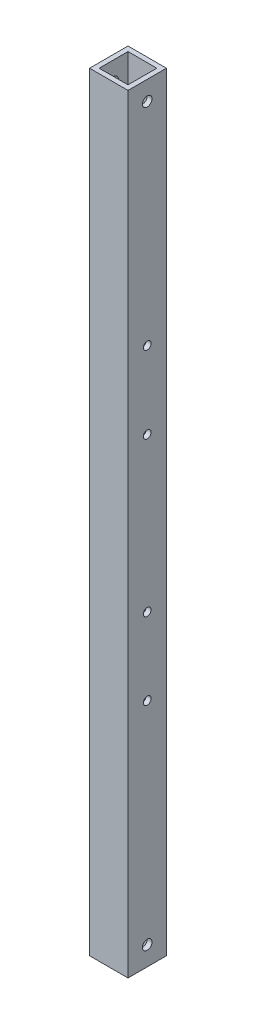
ISO-10303-21;
HEADER;
FILE_DESCRIPTION(('STEP AP214'),'2;1');
FILE_NAME('part.step','',(''),(''),'','','');
FILE_SCHEMA(('AUTOMOTIVE_DESIGN { 1 0 10303 214 1 1 1 1 }'));
ENDSEC;
DATA;
#1=APPLICATION_CONTEXT('core data for automotive mechanical design processes');
#2=APPLICATION_PROTOCOL_DEFINITION('international standard','automotive_design',2000,#1);
#3=PRODUCT_CONTEXT('',#1,'mechanical');
#4=PRODUCT('Part','Part','',(#3));
#5=PRODUCT_RELATED_PRODUCT_CATEGORY('part','',(#4));
#6=PRODUCT_DEFINITION_FORMATION('','',#4);
#7=PRODUCT_DEFINITION_CONTEXT('part definition',#1,'design');
#8=PRODUCT_DEFINITION('design','',#6,#7);
#9=PRODUCT_DEFINITION_SHAPE('','',#8);
#10=(LENGTH_UNIT() NAMED_UNIT(*) SI_UNIT(.MILLI.,.METRE.));
#11=(NAMED_UNIT(*) PLANE_ANGLE_UNIT() SI_UNIT($,.RADIAN.));
#12=(NAMED_UNIT(*) SI_UNIT($,.STERADIAN.) SOLID_ANGLE_UNIT());
#13=UNCERTAINTY_MEASURE_WITH_UNIT(LENGTH_MEASURE(1.E-05),#10,'distance_accuracy_value','');
#14=(GEOMETRIC_REPRESENTATION_CONTEXT(3) GLOBAL_UNCERTAINTY_ASSIGNED_CONTEXT((#13)) GLOBAL_UNIT_ASSIGNED_CONTEXT((#10,
#11,#12)) REPRESENTATION_CONTEXT('',''));
#15=CARTESIAN_POINT('',(0.,0.,0.));
#16=DIRECTION('',(0.,0.,1.));
#17=DIRECTION('',(1.,0.,0.));
#18=AXIS2_PLACEMENT_3D('',#15,#16,#17);
#19=CARTESIAN_POINT('',(0.,508.,0.));
#20=DIRECTION('',(0.,-1.,0.));
#21=DIRECTION('',(0.,0.,-1.));
#22=AXIS2_PLACEMENT_3D('',#19,#20,#21);
#23=PLANE('',#22);
#24=DIRECTION('',(0.,0.,1.));
#25=VECTOR('',#24,1.);
#26=CARTESIAN_POINT('',(0.,508.,0.));
#27=LINE('',#26,#25);
#28=CARTESIAN_POINT('',(0.,508.,-25.4));
#29=VERTEX_POINT('',#28);
#30=CARTESIAN_POINT('',(0.,508.,0.));
#31=VERTEX_POINT('',#30);
#32=EDGE_CURVE('E137',#29,#31,#27,.T.);
#33=ORIENTED_EDGE('',*,*,#32,.T.);
#34=DIRECTION('',(1.,0.,0.));
#35=VECTOR('',#34,1.);
#36=CARTESIAN_POINT('',(0.,508.,0.));
#37=LINE('',#36,#35);
#38=CARTESIAN_POINT('',(25.4,508.,0.));
#39=VERTEX_POINT('',#38);
#40=EDGE_CURVE('E140',#31,#39,#37,.T.);
#41=ORIENTED_EDGE('',*,*,#40,.T.);
#42=DIRECTION('',(0.,0.,-1.));
#43=VECTOR('',#42,1.);
#44=CARTESIAN_POINT('',(25.4,508.,0.));
#45=LINE('',#44,#43);
#46=CARTESIAN_POINT('',(25.4,508.,-25.4));
#47=VERTEX_POINT('',#46);
#48=EDGE_CURVE('E143',#39,#47,#45,.T.);
#49=ORIENTED_EDGE('',*,*,#48,.T.);
#50=DIRECTION('',(-1.,0.,0.));
#51=VECTOR('',#50,1.);
#52=CARTESIAN_POINT('',(0.,508.,-25.4));
#53=LINE('',#52,#51);
#54=EDGE_CURVE('E145',#47,#29,#53,.T.);
#55=ORIENTED_EDGE('',*,*,#54,.T.);
#56=EDGE_LOOP('',(#33,#41,#49,#55));
#57=FACE_BOUND('',#56,.T.);
#58=DIRECTION('',(1.,0.,0.));
#59=VECTOR('',#58,1.);
#60=CARTESIAN_POINT('',(3.175,508.,-3.175));
#61=LINE('',#60,#59);
#62=CARTESIAN_POINT('',(3.175,508.,-3.175));
#63=VERTEX_POINT('',#62);
#64=CARTESIAN_POINT('',(22.225,508.,-3.175));
#65=VERTEX_POINT('',#64);
#66=EDGE_CURVE('E99',#63,#65,#61,.T.);
#67=ORIENTED_EDGE('',*,*,#66,.F.);
#68=DIRECTION('',(0.,0.,1.));
#69=VECTOR('',#68,1.);
#70=CARTESIAN_POINT('',(3.175,508.,-3.175));
#71=LINE('',#70,#69);
#72=CARTESIAN_POINT('',(3.175,508.,-22.225));
#73=VERTEX_POINT('',#72);
#74=EDGE_CURVE('E121',#73,#63,#71,.T.);
#75=ORIENTED_EDGE('',*,*,#74,.F.);
#76=DIRECTION('',(-1.,0.,0.));
#77=VECTOR('',#76,1.);
#78=CARTESIAN_POINT('',(3.175,508.,-22.225));
#79=LINE('',#78,#77);
#80=CARTESIAN_POINT('',(22.225,508.,-22.225));
#81=VERTEX_POINT('',#80);
#82=EDGE_CURVE('E119',#81,#73,#79,.T.);
#83=ORIENTED_EDGE('',*,*,#82,.F.);
#84=DIRECTION('',(0.,0.,-1.));
#85=VECTOR('',#84,1.);
#86=CARTESIAN_POINT('',(22.225,508.,-3.175));
#87=LINE('',#86,#85);
#88=EDGE_CURVE('E107',#65,#81,#87,.T.);
#89=ORIENTED_EDGE('',*,*,#88,.F.);
#90=EDGE_LOOP('',(#67,#75,#83,#89));
#91=FACE_BOUND('',#90,.T.);
#92=ADVANCED_FACE('F32',(#57,#91),#23,.F.);
#93=CARTESIAN_POINT('',(0.,0.,0.));
#94=DIRECTION('',(0.,-1.,0.));
#95=DIRECTION('',(0.,0.,-1.));
#96=AXIS2_PLACEMENT_3D('',#93,#94,#95);
#97=PLANE('',#96);
#98=DIRECTION('',(0.,0.,1.));
#99=VECTOR('',#98,1.);
#100=CARTESIAN_POINT('',(0.,0.,0.));
#101=LINE('',#100,#99);
#102=CARTESIAN_POINT('',(0.,0.,-25.4));
#103=VERTEX_POINT('',#102);
#104=CARTESIAN_POINT('',(0.,0.,0.));
#105=VERTEX_POINT('',#104);
#106=EDGE_CURVE('E115',#103,#105,#101,.T.);
#107=ORIENTED_EDGE('',*,*,#106,.F.);
#108=DIRECTION('',(-1.,0.,0.));
#109=VECTOR('',#108,1.);
#110=CARTESIAN_POINT('',(0.,0.,-25.4));
#111=LINE('',#110,#109);
#112=CARTESIAN_POINT('',(25.4,0.,-25.4));
#113=VERTEX_POINT('',#112);
#114=EDGE_CURVE('E141',#113,#103,#111,.T.);
#115=ORIENTED_EDGE('',*,*,#114,.F.);
#116=DIRECTION('',(0.,0.,-1.));
#117=VECTOR('',#116,1.);
#118=CARTESIAN_POINT('',(25.4,0.,0.));
#119=LINE('',#118,#117);
#120=CARTESIAN_POINT('',(25.4,0.,0.));
#121=VERTEX_POINT('',#120);
#122=EDGE_CURVE('E152',#121,#113,#119,.T.);
#123=ORIENTED_EDGE('',*,*,#122,.F.);
#124=DIRECTION('',(1.,0.,0.));
#125=VECTOR('',#124,1.);
#126=CARTESIAN_POINT('',(0.,0.,0.));
#127=LINE('',#126,#125);
#128=EDGE_CURVE('E150',#105,#121,#127,.T.);
#129=ORIENTED_EDGE('',*,*,#128,.F.);
#130=EDGE_LOOP('',(#107,#115,#123,#129));
#131=FACE_BOUND('',#130,.T.);
#132=DIRECTION('',(0.,0.,1.));
#133=VECTOR('',#132,1.);
#134=CARTESIAN_POINT('',(3.175,0.,-3.175));
#135=LINE('',#134,#133);
#136=CARTESIAN_POINT('',(3.175,0.,-22.225));
#137=VERTEX_POINT('',#136);
#138=CARTESIAN_POINT('',(3.175,0.,-3.175));
#139=VERTEX_POINT('',#138);
#140=EDGE_CURVE('E108',#137,#139,#135,.T.);
#141=ORIENTED_EDGE('',*,*,#140,.T.);
#142=DIRECTION('',(1.,0.,0.));
#143=VECTOR('',#142,1.);
#144=CARTESIAN_POINT('',(3.175,0.,-3.175));
#145=LINE('',#144,#143);
#146=CARTESIAN_POINT('',(22.225,0.,-3.175));
#147=VERTEX_POINT('',#146);
#148=EDGE_CURVE('E57',#139,#147,#145,.T.);
#149=ORIENTED_EDGE('',*,*,#148,.T.);
#150=DIRECTION('',(0.,0.,-1.));
#151=VECTOR('',#150,1.);
#152=CARTESIAN_POINT('',(22.225,0.,-3.175));
#153=LINE('',#152,#151);
#154=CARTESIAN_POINT('',(22.225,0.,-22.225));
#155=VERTEX_POINT('',#154);
#156=EDGE_CURVE('E114',#147,#155,#153,.T.);
#157=ORIENTED_EDGE('',*,*,#156,.T.);
#158=DIRECTION('',(-1.,0.,0.));
#159=VECTOR('',#158,1.);
#160=CARTESIAN_POINT('',(3.175,0.,-22.225));
#161=LINE('',#160,#159);
#162=EDGE_CURVE('E129',#155,#137,#161,.T.);
#163=ORIENTED_EDGE('',*,*,#162,.T.);
#164=EDGE_LOOP('',(#141,#149,#157,#163));
#165=FACE_BOUND('',#164,.T.);
#166=ADVANCED_FACE('F244',(#131,#165),#97,.T.);
#167=CARTESIAN_POINT('',(0.,508.,0.));
#168=DIRECTION('',(1.,0.,0.));
#169=DIRECTION('',(0.,0.,-1.));
#170=AXIS2_PLACEMENT_3D('',#167,#168,#169);
#171=PLANE('',#170);
#172=CARTESIAN_POINT('',(0.,495.3,-12.7));
#173=DIRECTION('',(-1.,0.,0.));
#174=DIRECTION('',(0.,0.,-1.));
#175=AXIS2_PLACEMENT_3D('',#172,#173,#174);
#176=CIRCLE('',#175,3.175);
#177=CARTESIAN_POINT('',(0.,495.3,-15.875));
#178=VERTEX_POINT('',#177);
#179=EDGE_CURVE('E181',#178,#178,#176,.T.);
#180=ORIENTED_EDGE('',*,*,#179,.F.);
#181=EDGE_LOOP('',(#180));
#182=FACE_BOUND('',#181,.T.);
#183=CARTESIAN_POINT('',(0.,12.7,-12.7));
#184=DIRECTION('',(1.,0.,0.));
#185=DIRECTION('',(0.,0.,-1.));
#186=AXIS2_PLACEMENT_3D('',#183,#184,#185);
#187=CIRCLE('',#186,3.175);
#188=CARTESIAN_POINT('',(0.,12.7,-15.875));
#189=VERTEX_POINT('',#188);
#190=EDGE_CURVE('E163',#189,#189,#187,.T.);
#191=ORIENTED_EDGE('',*,*,#190,.T.);
#192=EDGE_LOOP('',(#191));
#193=FACE_BOUND('',#192,.T.);
#194=ORIENTED_EDGE('',*,*,#106,.T.);
#195=DIRECTION('',(0.,-1.,0.));
#196=VECTOR('',#195,1.);
#197=CARTESIAN_POINT('',(0.,508.,0.));
#198=LINE('',#197,#196);
#199=EDGE_CURVE('E11',#31,#105,#198,.T.);
#200=ORIENTED_EDGE('',*,*,#199,.F.);
#201=ORIENTED_EDGE('',*,*,#32,.F.);
#202=DIRECTION('',(0.,-1.,0.));
#203=VECTOR('',#202,1.);
#204=CARTESIAN_POINT('',(0.,508.,-25.4));
#205=LINE('',#204,#203);
#206=EDGE_CURVE('E147',#29,#103,#205,.T.);
#207=ORIENTED_EDGE('',*,*,#206,.T.);
#208=EDGE_LOOP('',(#194,#200,#201,#207));
#209=FACE_BOUND('',#208,.T.);
#210=ADVANCED_FACE('F34',(#182,#193,#209),#171,.F.);
#211=CARTESIAN_POINT('',(0.,508.,0.));
#212=DIRECTION('',(0.,0.,-1.));
#213=DIRECTION('',(-1.,0.,0.));
#214=AXIS2_PLACEMENT_3D('',#211,#212,#213);
#215=PLANE('',#214);
#216=ORIENTED_EDGE('',*,*,#128,.T.);
#217=DIRECTION('',(0.,-1.,0.));
#218=VECTOR('',#217,1.);
#219=CARTESIAN_POINT('',(25.4,508.,0.));
#220=LINE('',#219,#218);
#221=EDGE_CURVE('E41',#39,#121,#220,.T.);
#222=ORIENTED_EDGE('',*,*,#221,.F.);
#223=ORIENTED_EDGE('',*,*,#40,.F.);
#224=ORIENTED_EDGE('',*,*,#199,.T.);
#225=EDGE_LOOP('',(#216,#222,#223,#224));
#226=FACE_BOUND('',#225,.T.);
#227=ADVANCED_FACE('F222',(#226),#215,.F.);
#228=CARTESIAN_POINT('',(25.4,508.,0.));
#229=DIRECTION('',(-1.,0.,0.));
#230=DIRECTION('',(0.,0.,1.));
#231=AXIS2_PLACEMENT_3D('',#228,#229,#230);
#232=PLANE('',#231);
#233=CARTESIAN_POINT('',(25.4,355.600000000733,-12.7000000000511));
#234=DIRECTION('',(1.,0.,0.));
#235=DIRECTION('',(0.,0.,-1.));
#236=AXIS2_PLACEMENT_3D('',#233,#234,#235);
#237=CIRCLE('',#236,2.57968749999999);
#238=CARTESIAN_POINT('',(25.4,355.600000000733,-15.2796875000511));
#239=VERTEX_POINT('',#238);
#240=EDGE_CURVE('E190',#239,#239,#237,.T.);
#241=ORIENTED_EDGE('',*,*,#240,.F.);
#242=EDGE_LOOP('',(#241));
#243=FACE_BOUND('',#242,.T.);
#244=CARTESIAN_POINT('',(25.4,203.200000000733,-12.7000000000511));
#245=DIRECTION('',(1.,0.,0.));
#246=DIRECTION('',(0.,0.,-1.));
#247=AXIS2_PLACEMENT_3D('',#244,#245,#246);
#248=CIRCLE('',#247,2.5796875);
#249=CARTESIAN_POINT('',(25.4,203.200000000733,-15.2796875000511));
#250=VERTEX_POINT('',#249);
#251=EDGE_CURVE('E198',#250,#250,#248,.T.);
#252=ORIENTED_EDGE('',*,*,#251,.F.);
#253=EDGE_LOOP('',(#252));
#254=FACE_BOUND('',#253,.T.);
#255=CARTESIAN_POINT('',(25.4,152.400000000733,-12.7000000000511));
#256=DIRECTION('',(1.,0.,0.));
#257=DIRECTION('',(0.,0.,-1.));
#258=AXIS2_PLACEMENT_3D('',#255,#256,#257);
#259=CIRCLE('',#258,2.57968750000001);
#260=CARTESIAN_POINT('',(25.4,152.400000000733,-15.2796875000511));
#261=VERTEX_POINT('',#260);
#262=EDGE_CURVE('E191',#261,#261,#259,.T.);
#263=ORIENTED_EDGE('',*,*,#262,.F.);
#264=EDGE_LOOP('',(#263));
#265=FACE_BOUND('',#264,.T.);
#266=CARTESIAN_POINT('',(25.4,304.800000000733,-12.7000000000511));
#267=DIRECTION('',(1.,0.,0.));
#268=DIRECTION('',(0.,0.,-1.));
#269=AXIS2_PLACEMENT_3D('',#266,#267,#268);
#270=CIRCLE('',#269,2.5796875);
#271=CARTESIAN_POINT('',(25.4,304.800000000733,-15.2796875000511));
#272=VERTEX_POINT('',#271);
#273=EDGE_CURVE('E182',#272,#272,#270,.T.);
#274=ORIENTED_EDGE('',*,*,#273,.F.);
#275=EDGE_LOOP('',(#274));
#276=FACE_BOUND('',#275,.T.);
#277=CARTESIAN_POINT('',(25.4,495.3,-12.7));
#278=DIRECTION('',(-1.,0.,0.));
#279=DIRECTION('',(0.,0.,-1.));
#280=AXIS2_PLACEMENT_3D('',#277,#278,#279);
#281=CIRCLE('',#280,3.175);
#282=CARTESIAN_POINT('',(25.4,495.3,-15.875));
#283=VERTEX_POINT('',#282);
#284=EDGE_CURVE('E178',#283,#283,#281,.T.);
#285=ORIENTED_EDGE('',*,*,#284,.T.);
#286=EDGE_LOOP('',(#285));
#287=FACE_BOUND('',#286,.T.);
#288=CARTESIAN_POINT('',(25.4,12.7,-12.7));
#289=DIRECTION('',(1.,0.,0.));
#290=DIRECTION('',(0.,0.,-1.));
#291=AXIS2_PLACEMENT_3D('',#288,#289,#290);
#292=CIRCLE('',#291,3.175);
#293=CARTESIAN_POINT('',(25.4,12.7,-15.875));
#294=VERTEX_POINT('',#293);
#295=EDGE_CURVE('E168',#294,#294,#292,.T.);
#296=ORIENTED_EDGE('',*,*,#295,.F.);
#297=EDGE_LOOP('',(#296));
#298=FACE_BOUND('',#297,.T.);
#299=ORIENTED_EDGE('',*,*,#122,.T.);
#300=DIRECTION('',(0.,-1.,0.));
#301=VECTOR('',#300,1.);
#302=CARTESIAN_POINT('',(25.4,508.,-25.4));
#303=LINE('',#302,#301);
#304=EDGE_CURVE('E157',#47,#113,#303,.T.);
#305=ORIENTED_EDGE('',*,*,#304,.F.);
#306=ORIENTED_EDGE('',*,*,#48,.F.);
#307=ORIENTED_EDGE('',*,*,#221,.T.);
#308=EDGE_LOOP('',(#299,#305,#306,#307));
#309=FACE_BOUND('',#308,.T.);
#310=ADVANCED_FACE('F218',(#243,#254,#265,#276,#287,#298,#309),#232,.F.);
#311=CARTESIAN_POINT('',(0.,508.,-25.4));
#312=DIRECTION('',(0.,0.,1.));
#313=DIRECTION('',(1.,0.,0.));
#314=AXIS2_PLACEMENT_3D('',#311,#312,#313);
#315=PLANE('',#314);
#316=ORIENTED_EDGE('',*,*,#114,.T.);
#317=ORIENTED_EDGE('',*,*,#206,.F.);
#318=ORIENTED_EDGE('',*,*,#54,.F.);
#319=ORIENTED_EDGE('',*,*,#304,.T.);
#320=EDGE_LOOP('',(#316,#317,#318,#319));
#321=FACE_BOUND('',#320,.T.);
#322=ADVANCED_FACE('F221',(#321),#315,.F.);
#323=CARTESIAN_POINT('',(3.175,508.,-3.175));
#324=DIRECTION('',(0.,0.,-1.));
#325=DIRECTION('',(-1.,0.,0.));
#326=AXIS2_PLACEMENT_3D('',#323,#324,#325);
#327=PLANE('',#326);
#328=ORIENTED_EDGE('',*,*,#148,.F.);
#329=DIRECTION('',(0.,-1.,0.));
#330=VECTOR('',#329,1.);
#331=CARTESIAN_POINT('',(3.175,508.,-3.175));
#332=LINE('',#331,#330);
#333=EDGE_CURVE('E103',#63,#139,#332,.T.);
#334=ORIENTED_EDGE('',*,*,#333,.F.);
#335=ORIENTED_EDGE('',*,*,#66,.T.);
#336=DIRECTION('',(0.,-1.,0.));
#337=VECTOR('',#336,1.);
#338=CARTESIAN_POINT('',(22.225,508.,-3.175));
#339=LINE('',#338,#337);
#340=EDGE_CURVE('E102',#65,#147,#339,.T.);
#341=ORIENTED_EDGE('',*,*,#340,.T.);
#342=EDGE_LOOP('',(#328,#334,#335,#341));
#343=FACE_BOUND('',#342,.T.);
#344=ADVANCED_FACE('F101',(#343),#327,.T.);
#345=CARTESIAN_POINT('',(22.225,508.,-3.175));
#346=DIRECTION('',(-1.,0.,0.));
#347=DIRECTION('',(0.,0.,1.));
#348=AXIS2_PLACEMENT_3D('',#345,#346,#347);
#349=PLANE('',#348);
#350=CARTESIAN_POINT('',(22.225,355.600000000733,-12.7000000000511));
#351=DIRECTION('',(-1.,0.,0.));
#352=DIRECTION('',(0.,0.,1.));
#353=AXIS2_PLACEMENT_3D('',#350,#351,#352);
#354=CIRCLE('',#353,2.57968749999999);
#355=CARTESIAN_POINT('',(22.225,355.600000000733,-10.1203125000511));
#356=VERTEX_POINT('',#355);
#357=EDGE_CURVE('E201',#356,#356,#354,.F.);
#358=ORIENTED_EDGE('',*,*,#357,.T.);
#359=EDGE_LOOP('',(#358));
#360=FACE_BOUND('',#359,.T.);
#361=CARTESIAN_POINT('',(22.225,203.200000000733,-12.7000000000511));
#362=DIRECTION('',(-1.,0.,0.));
#363=DIRECTION('',(0.,0.,1.));
#364=AXIS2_PLACEMENT_3D('',#361,#362,#363);
#365=CIRCLE('',#364,2.5796875);
#366=CARTESIAN_POINT('',(22.225,203.200000000733,-10.1203125000511));
#367=VERTEX_POINT('',#366);
#368=EDGE_CURVE('E194',#367,#367,#365,.F.);
#369=ORIENTED_EDGE('',*,*,#368,.T.);
#370=EDGE_LOOP('',(#369));
#371=FACE_BOUND('',#370,.T.);
#372=CARTESIAN_POINT('',(22.225,152.400000000733,-12.7000000000511));
#373=DIRECTION('',(-1.,0.,0.));
#374=DIRECTION('',(0.,0.,1.));
#375=AXIS2_PLACEMENT_3D('',#372,#373,#374);
#376=CIRCLE('',#375,2.57968750000001);
#377=CARTESIAN_POINT('',(22.225,152.400000000733,-10.1203125000511));
#378=VERTEX_POINT('',#377);
#379=EDGE_CURVE('E195',#378,#378,#376,.F.);
#380=ORIENTED_EDGE('',*,*,#379,.T.);
#381=EDGE_LOOP('',(#380));
#382=FACE_BOUND('',#381,.T.);
#383=CARTESIAN_POINT('',(22.225,304.800000000733,-12.7000000000511));
#384=DIRECTION('',(-1.,0.,0.));
#385=DIRECTION('',(0.,0.,1.));
#386=AXIS2_PLACEMENT_3D('',#383,#384,#385);
#387=CIRCLE('',#386,2.5796875);
#388=CARTESIAN_POINT('',(22.225,304.800000000733,-10.1203125000511));
#389=VERTEX_POINT('',#388);
#390=EDGE_CURVE('E187',#389,#389,#387,.F.);
#391=ORIENTED_EDGE('',*,*,#390,.T.);
#392=EDGE_LOOP('',(#391));
#393=FACE_BOUND('',#392,.T.);
#394=CARTESIAN_POINT('',(22.225,495.3,-12.7));
#395=DIRECTION('',(-1.,0.,0.));
#396=DIRECTION('',(0.,0.,1.));
#397=AXIS2_PLACEMENT_3D('',#394,#395,#396);
#398=CIRCLE('',#397,3.175);
#399=CARTESIAN_POINT('',(22.225,495.3,-9.52499999999998));
#400=VERTEX_POINT('',#399);
#401=EDGE_CURVE('E173',#400,#400,#398,.F.);
#402=ORIENTED_EDGE('',*,*,#401,.T.);
#403=EDGE_LOOP('',(#402));
#404=FACE_BOUND('',#403,.T.);
#405=CARTESIAN_POINT('',(22.225,12.7,-12.7));
#406=DIRECTION('',(-1.,0.,0.));
#407=DIRECTION('',(0.,0.,1.));
#408=AXIS2_PLACEMENT_3D('',#405,#406,#407);
#409=CIRCLE('',#408,3.175);
#410=CARTESIAN_POINT('',(22.225,12.7,-9.52499999999998));
#411=VERTEX_POINT('',#410);
#412=EDGE_CURVE('E127',#411,#411,#409,.T.);
#413=ORIENTED_EDGE('',*,*,#412,.F.);
#414=EDGE_LOOP('',(#413));
#415=FACE_BOUND('',#414,.T.);
#416=ORIENTED_EDGE('',*,*,#156,.F.);
#417=ORIENTED_EDGE('',*,*,#340,.F.);
#418=ORIENTED_EDGE('',*,*,#88,.T.);
#419=DIRECTION('',(0.,-1.,0.));
#420=VECTOR('',#419,1.);
#421=CARTESIAN_POINT('',(22.225,508.,-22.225));
#422=LINE('',#421,#420);
#423=EDGE_CURVE('E116',#81,#155,#422,.T.);
#424=ORIENTED_EDGE('',*,*,#423,.T.);
#425=EDGE_LOOP('',(#416,#417,#418,#424));
#426=FACE_BOUND('',#425,.T.);
#427=ADVANCED_FACE('F111',(#360,#371,#382,#393,#404,#415,#426),#349,.T.);
#428=CARTESIAN_POINT('',(3.175,508.,-22.225));
#429=DIRECTION('',(0.,0.,1.));
#430=DIRECTION('',(1.,0.,0.));
#431=AXIS2_PLACEMENT_3D('',#428,#429,#430);
#432=PLANE('',#431);
#433=ORIENTED_EDGE('',*,*,#162,.F.);
#434=ORIENTED_EDGE('',*,*,#423,.F.);
#435=ORIENTED_EDGE('',*,*,#82,.T.);
#436=DIRECTION('',(0.,-1.,0.));
#437=VECTOR('',#436,1.);
#438=CARTESIAN_POINT('',(3.175,508.,-22.225));
#439=LINE('',#438,#437);
#440=EDGE_CURVE('E49',#73,#137,#439,.T.);
#441=ORIENTED_EDGE('',*,*,#440,.T.);
#442=EDGE_LOOP('',(#433,#434,#435,#441));
#443=FACE_BOUND('',#442,.T.);
#444=ADVANCED_FACE('F272',(#443),#432,.T.);
#445=CARTESIAN_POINT('',(3.175,508.,-3.175));
#446=DIRECTION('',(1.,0.,0.));
#447=DIRECTION('',(0.,0.,-1.));
#448=AXIS2_PLACEMENT_3D('',#445,#446,#447);
#449=PLANE('',#448);
#450=CARTESIAN_POINT('',(3.175,495.3,-12.7));
#451=DIRECTION('',(1.,0.,0.));
#452=DIRECTION('',(0.,0.,-1.));
#453=AXIS2_PLACEMENT_3D('',#450,#451,#452);
#454=CIRCLE('',#453,3.175);
#455=CARTESIAN_POINT('',(3.175,495.3,-15.875));
#456=VERTEX_POINT('',#455);
#457=EDGE_CURVE('E36',#456,#456,#454,.F.);
#458=ORIENTED_EDGE('',*,*,#457,.T.);
#459=EDGE_LOOP('',(#458));
#460=FACE_BOUND('',#459,.T.);
#461=CARTESIAN_POINT('',(3.175,12.7,-12.7));
#462=DIRECTION('',(1.,0.,0.));
#463=DIRECTION('',(0.,0.,-1.));
#464=AXIS2_PLACEMENT_3D('',#461,#462,#463);
#465=CIRCLE('',#464,3.175);
#466=CARTESIAN_POINT('',(3.175,12.7,-15.875));
#467=VERTEX_POINT('',#466);
#468=EDGE_CURVE('E161',#467,#467,#465,.T.);
#469=ORIENTED_EDGE('',*,*,#468,.F.);
#470=EDGE_LOOP('',(#469));
#471=FACE_BOUND('',#470,.T.);
#472=ORIENTED_EDGE('',*,*,#140,.F.);
#473=ORIENTED_EDGE('',*,*,#440,.F.);
#474=ORIENTED_EDGE('',*,*,#74,.T.);
#475=ORIENTED_EDGE('',*,*,#333,.T.);
#476=EDGE_LOOP('',(#472,#473,#474,#475));
#477=FACE_BOUND('',#476,.T.);
#478=ADVANCED_FACE('F276',(#460,#471,#477),#449,.T.);
#479=CARTESIAN_POINT('',(0.,12.7,-12.7));
#480=DIRECTION('',(1.,0.,0.));
#481=DIRECTION('',(0.,0.,-1.));
#482=AXIS2_PLACEMENT_3D('',#479,#480,#481);
#483=CYLINDRICAL_SURFACE('',#482,3.175);
#484=ORIENTED_EDGE('',*,*,#468,.T.);
#485=EDGE_LOOP('',(#484));
#486=FACE_BOUND('',#485,.T.);
#487=ORIENTED_EDGE('',*,*,#190,.F.);
#488=EDGE_LOOP('',(#487));
#489=FACE_BOUND('',#488,.T.);
#490=ADVANCED_FACE('F282',(#486,#489),#483,.F.);
#491=ORIENTED_EDGE('',*,*,#412,.T.);
#492=EDGE_LOOP('',(#491));
#493=FACE_BOUND('',#492,.T.);
#494=ORIENTED_EDGE('',*,*,#295,.T.);
#495=EDGE_LOOP('',(#494));
#496=FACE_BOUND('',#495,.T.);
#497=ADVANCED_FACE('F286',(#493,#496),#483,.F.);
#498=CARTESIAN_POINT('',(0.,495.3,-12.7));
#499=DIRECTION('',(1.,0.,0.));
#500=DIRECTION('',(0.,0.,-1.));
#501=AXIS2_PLACEMENT_3D('',#498,#499,#500);
#502=CYLINDRICAL_SURFACE('',#501,3.175);
#503=ORIENTED_EDGE('',*,*,#457,.F.);
#504=EDGE_LOOP('',(#503));
#505=FACE_BOUND('',#504,.T.);
#506=ORIENTED_EDGE('',*,*,#179,.T.);
#507=EDGE_LOOP('',(#506));
#508=FACE_BOUND('',#507,.T.);
#509=ADVANCED_FACE('F287',(#505,#508),#502,.F.);
#510=ORIENTED_EDGE('',*,*,#401,.F.);
#511=EDGE_LOOP('',(#510));
#512=FACE_BOUND('',#511,.T.);
#513=ORIENTED_EDGE('',*,*,#284,.F.);
#514=EDGE_LOOP('',(#513));
#515=FACE_BOUND('',#514,.T.);
#516=ADVANCED_FACE('F290',(#512,#515),#502,.F.);
#517=CARTESIAN_POINT('',(-0.00100000000003223,304.800000000733,-12.7000000000511));
#518=DIRECTION('',(1.,0.,0.));
#519=DIRECTION('',(0.,0.,-1.));
#520=AXIS2_PLACEMENT_3D('',#517,#518,#519);
#521=CYLINDRICAL_SURFACE('',#520,2.5796875);
#522=ORIENTED_EDGE('',*,*,#390,.F.);
#523=EDGE_LOOP('',(#522));
#524=FACE_BOUND('',#523,.T.);
#525=ORIENTED_EDGE('',*,*,#273,.T.);
#526=EDGE_LOOP('',(#525));
#527=FACE_BOUND('',#526,.T.);
#528=ADVANCED_FACE('F292',(#524,#527),#521,.F.);
#529=CARTESIAN_POINT('',(-0.00100000000003223,152.400000000733,-12.7000000000511));
#530=DIRECTION('',(1.,0.,0.));
#531=DIRECTION('',(0.,0.,-1.));
#532=AXIS2_PLACEMENT_3D('',#529,#530,#531);
#533=CYLINDRICAL_SURFACE('',#532,2.57968750000001);
#534=ORIENTED_EDGE('',*,*,#379,.F.);
#535=EDGE_LOOP('',(#534));
#536=FACE_BOUND('',#535,.T.);
#537=ORIENTED_EDGE('',*,*,#262,.T.);
#538=EDGE_LOOP('',(#537));
#539=FACE_BOUND('',#538,.T.);
#540=ADVANCED_FACE('F295',(#536,#539),#533,.F.);
#541=CARTESIAN_POINT('',(-0.00100000000003223,203.200000000733,-12.7000000000511));
#542=DIRECTION('',(1.,0.,0.));
#543=DIRECTION('',(0.,0.,-1.));
#544=AXIS2_PLACEMENT_3D('',#541,#542,#543);
#545=CYLINDRICAL_SURFACE('',#544,2.5796875);
#546=ORIENTED_EDGE('',*,*,#368,.F.);
#547=EDGE_LOOP('',(#546));
#548=FACE_BOUND('',#547,.T.);
#549=ORIENTED_EDGE('',*,*,#251,.T.);
#550=EDGE_LOOP('',(#549));
#551=FACE_BOUND('',#550,.T.);
#552=ADVANCED_FACE('F214',(#548,#551),#545,.F.);
#553=CARTESIAN_POINT('',(-0.00100000000003223,355.600000000733,-12.7000000000511));
#554=DIRECTION('',(1.,0.,0.));
#555=DIRECTION('',(0.,0.,-1.));
#556=AXIS2_PLACEMENT_3D('',#553,#554,#555);
#557=CYLINDRICAL_SURFACE('',#556,2.57968749999999);
#558=ORIENTED_EDGE('',*,*,#357,.F.);
#559=EDGE_LOOP('',(#558));
#560=FACE_BOUND('',#559,.T.);
#561=ORIENTED_EDGE('',*,*,#240,.T.);
#562=EDGE_LOOP('',(#561));
#563=FACE_BOUND('',#562,.T.);
#564=ADVANCED_FACE('F211',(#560,#563),#557,.F.);
#565=CLOSED_SHELL('',(#92,#166,#210,#227,#310,#322,#344,#427,#444,#478,#490,#497,#509,#516,#528,
#540,#552,#564));
#566=MANIFOLD_SOLID_BREP('B2',#565);
#567=ADVANCED_BREP_SHAPE_REPRESENTATION('',(#18,#566),#14);
#568=SHAPE_DEFINITION_REPRESENTATION(#9,#567);
ENDSEC;
END-ISO-10303-21;
